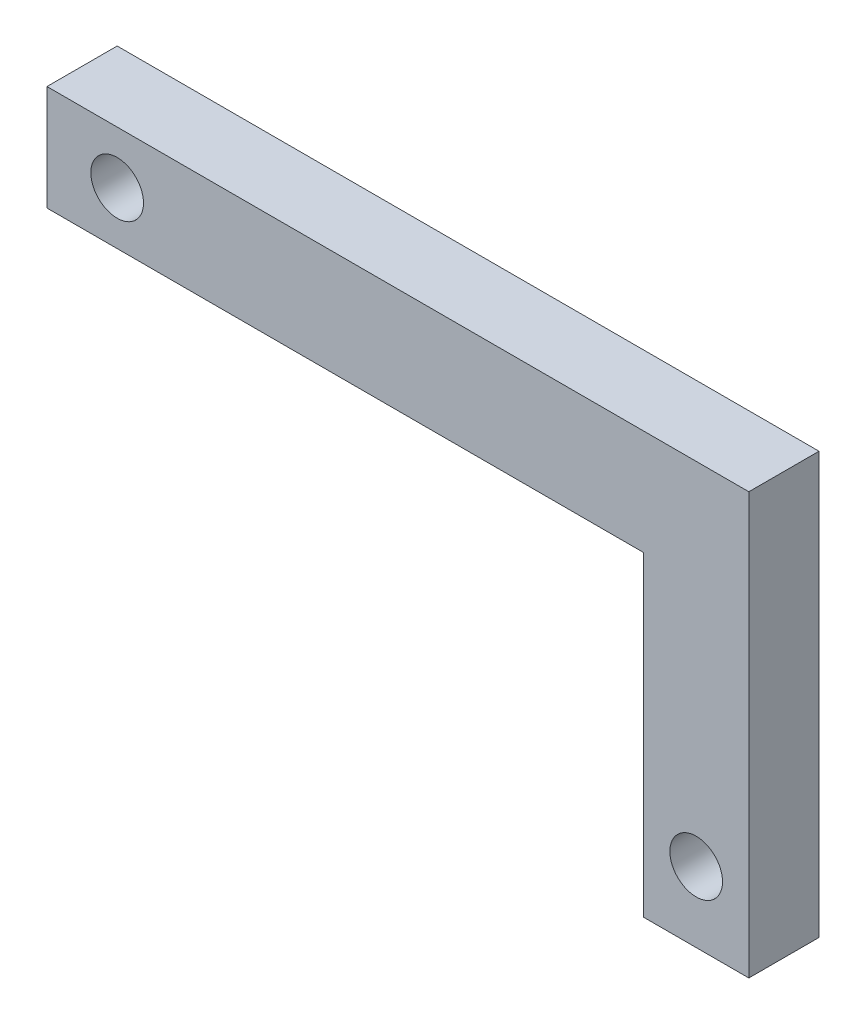
ISO-10303-21;
HEADER;
FILE_DESCRIPTION(('STEP AP214'),'2;1');
FILE_NAME('part.step','',(''),(''),'','','');
FILE_SCHEMA(('AUTOMOTIVE_DESIGN { 1 0 10303 214 1 1 1 1 }'));
ENDSEC;
DATA;
#1=APPLICATION_CONTEXT('core data for automotive mechanical design processes');
#2=APPLICATION_PROTOCOL_DEFINITION('international standard','automotive_design',2000,#1);
#3=PRODUCT_CONTEXT('',#1,'mechanical');
#4=PRODUCT('Part','Part','',(#3));
#5=PRODUCT_RELATED_PRODUCT_CATEGORY('part','',(#4));
#6=PRODUCT_DEFINITION_FORMATION('','',#4);
#7=PRODUCT_DEFINITION_CONTEXT('part definition',#1,'design');
#8=PRODUCT_DEFINITION('design','',#6,#7);
#9=PRODUCT_DEFINITION_SHAPE('','',#8);
#10=(LENGTH_UNIT() NAMED_UNIT(*) SI_UNIT(.MILLI.,.METRE.));
#11=(NAMED_UNIT(*) PLANE_ANGLE_UNIT() SI_UNIT($,.RADIAN.));
#12=(NAMED_UNIT(*) SI_UNIT($,.STERADIAN.) SOLID_ANGLE_UNIT());
#13=UNCERTAINTY_MEASURE_WITH_UNIT(LENGTH_MEASURE(1.E-05),#10,'distance_accuracy_value','');
#14=(GEOMETRIC_REPRESENTATION_CONTEXT(3) GLOBAL_UNCERTAINTY_ASSIGNED_CONTEXT((#13)) GLOBAL_UNIT_ASSIGNED_CONTEXT((#10,
#11,#12)) REPRESENTATION_CONTEXT('',''));
#15=CARTESIAN_POINT('',(0.,0.,0.));
#16=DIRECTION('',(0.,0.,1.));
#17=DIRECTION('',(1.,0.,0.));
#18=AXIS2_PLACEMENT_3D('',#15,#16,#17);
#19=CARTESIAN_POINT('',(0.,0.,25.4));
#20=DIRECTION('',(0.,1.,0.));
#21=DIRECTION('',(0.,0.,1.));
#22=AXIS2_PLACEMENT_3D('',#19,#20,#21);
#23=PLANE('',#22);
#24=DIRECTION('',(1.,0.,0.));
#25=VECTOR('',#24,1.);
#26=CARTESIAN_POINT('',(0.,0.,0.));
#27=LINE('',#26,#25);
#28=CARTESIAN_POINT('',(0.,0.,0.));
#29=VERTEX_POINT('',#28);
#30=CARTESIAN_POINT('',(215.9,0.,0.));
#31=VERTEX_POINT('',#30);
#32=EDGE_CURVE('E154',#29,#31,#27,.T.);
#33=ORIENTED_EDGE('',*,*,#32,.T.);
#34=DIRECTION('',(0.,0.,-1.));
#35=VECTOR('',#34,1.);
#36=CARTESIAN_POINT('',(215.9,0.,25.4));
#37=LINE('',#36,#35);
#38=CARTESIAN_POINT('',(215.9,0.,25.4));
#39=VERTEX_POINT('',#38);
#40=EDGE_CURVE('E13',#39,#31,#37,.T.);
#41=ORIENTED_EDGE('',*,*,#40,.F.);
#42=DIRECTION('',(1.,0.,0.));
#43=VECTOR('',#42,1.);
#44=CARTESIAN_POINT('',(0.,0.,25.4));
#45=LINE('',#44,#43);
#46=CARTESIAN_POINT('',(0.,0.,25.4));
#47=VERTEX_POINT('',#46);
#48=EDGE_CURVE('E175',#47,#39,#45,.T.);
#49=ORIENTED_EDGE('',*,*,#48,.F.);
#50=DIRECTION('',(0.,0.,-1.));
#51=VECTOR('',#50,1.);
#52=CARTESIAN_POINT('',(0.,0.,25.4));
#53=LINE('',#52,#51);
#54=EDGE_CURVE('E74',#47,#29,#53,.T.);
#55=ORIENTED_EDGE('',*,*,#54,.T.);
#56=EDGE_LOOP('',(#33,#41,#49,#55));
#57=FACE_BOUND('',#56,.T.);
#58=ADVANCED_FACE('F57',(#57),#23,.F.);
#59=CARTESIAN_POINT('',(215.9,1.04854396770154E-13,25.4));
#60=DIRECTION('',(1.,0.,0.));
#61=DIRECTION('',(0.,1.,0.));
#62=AXIS2_PLACEMENT_3D('',#59,#60,#61);
#63=PLANE('',#62);
#64=DIRECTION('',(0.,-1.,0.));
#65=VECTOR('',#64,1.);
#66=CARTESIAN_POINT('',(215.9,1.04854396770154E-13,0.));
#67=LINE('',#66,#65);
#68=CARTESIAN_POINT('',(215.9,-114.3,0.));
#69=VERTEX_POINT('',#68);
#70=EDGE_CURVE('E157',#31,#69,#67,.T.);
#71=ORIENTED_EDGE('',*,*,#70,.T.);
#72=DIRECTION('',(0.,0.,-1.));
#73=VECTOR('',#72,1.);
#74=CARTESIAN_POINT('',(215.9,-114.3,25.4));
#75=LINE('',#74,#73);
#76=CARTESIAN_POINT('',(215.9,-114.3,25.4));
#77=VERTEX_POINT('',#76);
#78=EDGE_CURVE('E66',#77,#69,#75,.T.);
#79=ORIENTED_EDGE('',*,*,#78,.F.);
#80=DIRECTION('',(0.,-1.,0.));
#81=VECTOR('',#80,1.);
#82=CARTESIAN_POINT('',(215.9,1.04854396770154E-13,25.4));
#83=LINE('',#82,#81);
#84=EDGE_CURVE('E112',#39,#77,#83,.T.);
#85=ORIENTED_EDGE('',*,*,#84,.F.);
#86=ORIENTED_EDGE('',*,*,#40,.T.);
#87=EDGE_LOOP('',(#71,#79,#85,#86));
#88=FACE_BOUND('',#87,.T.);
#89=ADVANCED_FACE('F185',(#88),#63,.F.);
#90=CARTESIAN_POINT('',(0.,-114.3,25.4));
#91=DIRECTION('',(0.,-1.,0.));
#92=DIRECTION('',(1.,0.,0.));
#93=AXIS2_PLACEMENT_3D('',#90,#91,#92);
#94=PLANE('',#93);
#95=DIRECTION('',(-1.,0.,0.));
#96=VECTOR('',#95,1.);
#97=CARTESIAN_POINT('',(0.,-114.3,0.));
#98=LINE('',#97,#96);
#99=CARTESIAN_POINT('',(254.,-114.3,0.));
#100=VERTEX_POINT('',#99);
#101=EDGE_CURVE('E162',#100,#69,#98,.T.);
#102=ORIENTED_EDGE('',*,*,#101,.F.);
#103=DIRECTION('',(0.,0.,-1.));
#104=VECTOR('',#103,1.);
#105=CARTESIAN_POINT('',(254.,-114.3,25.4));
#106=LINE('',#105,#104);
#107=CARTESIAN_POINT('',(254.,-114.3,25.4));
#108=VERTEX_POINT('',#107);
#109=EDGE_CURVE('E144',#108,#100,#106,.T.);
#110=ORIENTED_EDGE('',*,*,#109,.F.);
#111=DIRECTION('',(-1.,0.,0.));
#112=VECTOR('',#111,1.);
#113=CARTESIAN_POINT('',(0.,-114.3,25.4));
#114=LINE('',#113,#112);
#115=EDGE_CURVE('E132',#108,#77,#114,.T.);
#116=ORIENTED_EDGE('',*,*,#115,.T.);
#117=ORIENTED_EDGE('',*,*,#78,.T.);
#118=EDGE_LOOP('',(#102,#110,#116,#117));
#119=FACE_BOUND('',#118,.T.);
#120=ADVANCED_FACE('F184',(#119),#94,.T.);
#121=CARTESIAN_POINT('',(254.,0.,25.4));
#122=DIRECTION('',(-1.,0.,0.));
#123=DIRECTION('',(0.,0.,1.));
#124=AXIS2_PLACEMENT_3D('',#121,#122,#123);
#125=PLANE('',#124);
#126=DIRECTION('',(0.,1.,0.));
#127=VECTOR('',#126,1.);
#128=CARTESIAN_POINT('',(254.,0.,0.));
#129=LINE('',#128,#127);
#130=CARTESIAN_POINT('',(254.,38.1,0.));
#131=VERTEX_POINT('',#130);
#132=EDGE_CURVE('E140',#100,#131,#129,.T.);
#133=ORIENTED_EDGE('',*,*,#132,.T.);
#134=DIRECTION('',(0.,0.,-1.));
#135=VECTOR('',#134,1.);
#136=CARTESIAN_POINT('',(254.,38.1,25.4));
#137=LINE('',#136,#135);
#138=CARTESIAN_POINT('',(254.,38.1,25.4));
#139=VERTEX_POINT('',#138);
#140=EDGE_CURVE('E137',#139,#131,#137,.T.);
#141=ORIENTED_EDGE('',*,*,#140,.F.);
#142=DIRECTION('',(0.,1.,0.));
#143=VECTOR('',#142,1.);
#144=CARTESIAN_POINT('',(254.,0.,25.4));
#145=LINE('',#144,#143);
#146=EDGE_CURVE('E125',#108,#139,#145,.T.);
#147=ORIENTED_EDGE('',*,*,#146,.F.);
#148=ORIENTED_EDGE('',*,*,#109,.T.);
#149=EDGE_LOOP('',(#133,#141,#147,#148));
#150=FACE_BOUND('',#149,.T.);
#151=ADVANCED_FACE('F138',(#150),#125,.F.);
#152=CARTESIAN_POINT('',(0.,38.1,25.4));
#153=DIRECTION('',(0.,1.,0.));
#154=DIRECTION('',(0.,0.,1.));
#155=AXIS2_PLACEMENT_3D('',#152,#153,#154);
#156=PLANE('',#155);
#157=DIRECTION('',(1.,0.,0.));
#158=VECTOR('',#157,1.);
#159=CARTESIAN_POINT('',(0.,38.1,0.));
#160=LINE('',#159,#158);
#161=CARTESIAN_POINT('',(0.,38.1,0.));
#162=VERTEX_POINT('',#161);
#163=EDGE_CURVE('E168',#162,#131,#160,.T.);
#164=ORIENTED_EDGE('',*,*,#163,.F.);
#165=DIRECTION('',(0.,0.,-1.));
#166=VECTOR('',#165,1.);
#167=CARTESIAN_POINT('',(0.,38.1,25.4));
#168=LINE('',#167,#166);
#169=CARTESIAN_POINT('',(0.,38.1,25.4));
#170=VERTEX_POINT('',#169);
#171=EDGE_CURVE('E98',#170,#162,#168,.T.);
#172=ORIENTED_EDGE('',*,*,#171,.F.);
#173=DIRECTION('',(1.,0.,0.));
#174=VECTOR('',#173,1.);
#175=CARTESIAN_POINT('',(0.,38.1,25.4));
#176=LINE('',#175,#174);
#177=EDGE_CURVE('E130',#170,#139,#176,.T.);
#178=ORIENTED_EDGE('',*,*,#177,.T.);
#179=ORIENTED_EDGE('',*,*,#140,.T.);
#180=EDGE_LOOP('',(#164,#172,#178,#179));
#181=FACE_BOUND('',#180,.T.);
#182=ADVANCED_FACE('F146',(#181),#156,.T.);
#183=CARTESIAN_POINT('',(0.,0.,25.4));
#184=DIRECTION('',(-1.,0.,0.));
#185=DIRECTION('',(0.,0.,1.));
#186=AXIS2_PLACEMENT_3D('',#183,#184,#185);
#187=PLANE('',#186);
#188=DIRECTION('',(0.,1.,0.));
#189=VECTOR('',#188,1.);
#190=CARTESIAN_POINT('',(0.,0.,0.));
#191=LINE('',#190,#189);
#192=EDGE_CURVE('E171',#29,#162,#191,.T.);
#193=ORIENTED_EDGE('',*,*,#192,.F.);
#194=ORIENTED_EDGE('',*,*,#54,.F.);
#195=DIRECTION('',(0.,1.,0.));
#196=VECTOR('',#195,1.);
#197=CARTESIAN_POINT('',(0.,0.,25.4));
#198=LINE('',#197,#196);
#199=EDGE_CURVE('E148',#47,#170,#198,.T.);
#200=ORIENTED_EDGE('',*,*,#199,.T.);
#201=ORIENTED_EDGE('',*,*,#171,.T.);
#202=EDGE_LOOP('',(#193,#194,#200,#201));
#203=FACE_BOUND('',#202,.T.);
#204=ADVANCED_FACE('F189',(#203),#187,.T.);
#205=CARTESIAN_POINT('',(0.,0.,25.4));
#206=DIRECTION('',(0.,0.,1.));
#207=DIRECTION('',(1.,0.,0.));
#208=AXIS2_PLACEMENT_3D('',#205,#206,#207);
#209=PLANE('',#208);
#210=CARTESIAN_POINT('',(234.95,-88.9,25.4));
#211=DIRECTION('',(0.,0.,1.));
#212=DIRECTION('',(1.,0.,0.));
#213=AXIS2_PLACEMENT_3D('',#210,#211,#212);
#214=CIRCLE('',#213,9.525);
#215=CARTESIAN_POINT('',(244.475,-88.9,25.4));
#216=VERTEX_POINT('',#215);
#217=EDGE_CURVE('E218',#216,#216,#214,.T.);
#218=ORIENTED_EDGE('',*,*,#217,.F.);
#219=EDGE_LOOP('',(#218));
#220=FACE_BOUND('',#219,.T.);
#221=CARTESIAN_POINT('',(25.4,19.05,25.4));
#222=DIRECTION('',(0.,0.,1.));
#223=DIRECTION('',(1.,0.,0.));
#224=AXIS2_PLACEMENT_3D('',#221,#222,#223);
#225=CIRCLE('',#224,9.52500000000001);
#226=CARTESIAN_POINT('',(34.925,19.05,25.4));
#227=VERTEX_POINT('',#226);
#228=EDGE_CURVE('E209',#227,#227,#225,.T.);
#229=ORIENTED_EDGE('',*,*,#228,.F.);
#230=EDGE_LOOP('',(#229));
#231=FACE_BOUND('',#230,.T.);
#232=ORIENTED_EDGE('',*,*,#48,.T.);
#233=ORIENTED_EDGE('',*,*,#84,.T.);
#234=ORIENTED_EDGE('',*,*,#115,.F.);
#235=ORIENTED_EDGE('',*,*,#146,.T.);
#236=ORIENTED_EDGE('',*,*,#177,.F.);
#237=ORIENTED_EDGE('',*,*,#199,.F.);
#238=EDGE_LOOP('',(#232,#233,#234,#235,#236,#237));
#239=FACE_BOUND('',#238,.T.);
#240=ADVANCED_FACE('F127',(#220,#231,#239),#209,.T.);
#241=CARTESIAN_POINT('',(0.,0.,0.));
#242=DIRECTION('',(0.,0.,1.));
#243=DIRECTION('',(1.,0.,0.));
#244=AXIS2_PLACEMENT_3D('',#241,#242,#243);
#245=PLANE('',#244);
#246=CARTESIAN_POINT('',(234.95,-88.9,0.));
#247=DIRECTION('',(0.,0.,1.));
#248=DIRECTION('',(1.,0.,0.));
#249=AXIS2_PLACEMENT_3D('',#246,#247,#248);
#250=CIRCLE('',#249,9.525);
#251=CARTESIAN_POINT('',(244.475,-88.9,0.));
#252=VERTEX_POINT('',#251);
#253=EDGE_CURVE('E214',#252,#252,#250,.T.);
#254=ORIENTED_EDGE('',*,*,#253,.T.);
#255=EDGE_LOOP('',(#254));
#256=FACE_BOUND('',#255,.T.);
#257=CARTESIAN_POINT('',(25.4,19.05,0.));
#258=DIRECTION('',(0.,0.,1.));
#259=DIRECTION('',(1.,0.,0.));
#260=AXIS2_PLACEMENT_3D('',#257,#258,#259);
#261=CIRCLE('',#260,9.52500000000001);
#262=CARTESIAN_POINT('',(34.925,19.05,0.));
#263=VERTEX_POINT('',#262);
#264=EDGE_CURVE('E158',#263,#263,#261,.T.);
#265=ORIENTED_EDGE('',*,*,#264,.T.);
#266=EDGE_LOOP('',(#265));
#267=FACE_BOUND('',#266,.T.);
#268=ORIENTED_EDGE('',*,*,#32,.F.);
#269=ORIENTED_EDGE('',*,*,#192,.T.);
#270=ORIENTED_EDGE('',*,*,#163,.T.);
#271=ORIENTED_EDGE('',*,*,#132,.F.);
#272=ORIENTED_EDGE('',*,*,#101,.T.);
#273=ORIENTED_EDGE('',*,*,#70,.F.);
#274=EDGE_LOOP('',(#268,#269,#270,#271,#272,#273));
#275=FACE_BOUND('',#274,.T.);
#276=ADVANCED_FACE('F188',(#256,#267,#275),#245,.F.);
#277=CARTESIAN_POINT('',(25.4,19.05,0.));
#278=DIRECTION('',(0.,0.,1.));
#279=DIRECTION('',(1.,0.,0.));
#280=AXIS2_PLACEMENT_3D('',#277,#278,#279);
#281=CYLINDRICAL_SURFACE('',#280,9.52500000000001);
#282=ORIENTED_EDGE('',*,*,#264,.F.);
#283=EDGE_LOOP('',(#282));
#284=FACE_BOUND('',#283,.T.);
#285=ORIENTED_EDGE('',*,*,#228,.T.);
#286=EDGE_LOOP('',(#285));
#287=FACE_BOUND('',#286,.T.);
#288=ADVANCED_FACE('F231',(#284,#287),#281,.F.);
#289=CARTESIAN_POINT('',(234.95,-88.9,0.));
#290=DIRECTION('',(0.,0.,1.));
#291=DIRECTION('',(1.,0.,0.));
#292=AXIS2_PLACEMENT_3D('',#289,#290,#291);
#293=CYLINDRICAL_SURFACE('',#292,9.525);
#294=ORIENTED_EDGE('',*,*,#253,.F.);
#295=EDGE_LOOP('',(#294));
#296=FACE_BOUND('',#295,.T.);
#297=ORIENTED_EDGE('',*,*,#217,.T.);
#298=EDGE_LOOP('',(#297));
#299=FACE_BOUND('',#298,.T.);
#300=ADVANCED_FACE('F228',(#296,#299),#293,.F.);
#301=CLOSED_SHELL('',(#58,#89,#120,#151,#182,#204,#240,#276,#288,#300));
#302=MANIFOLD_SOLID_BREP('B2',#301);
#303=ADVANCED_BREP_SHAPE_REPRESENTATION('',(#18,#302),#14);
#304=SHAPE_DEFINITION_REPRESENTATION(#9,#303);
ENDSEC;
END-ISO-10303-21;
